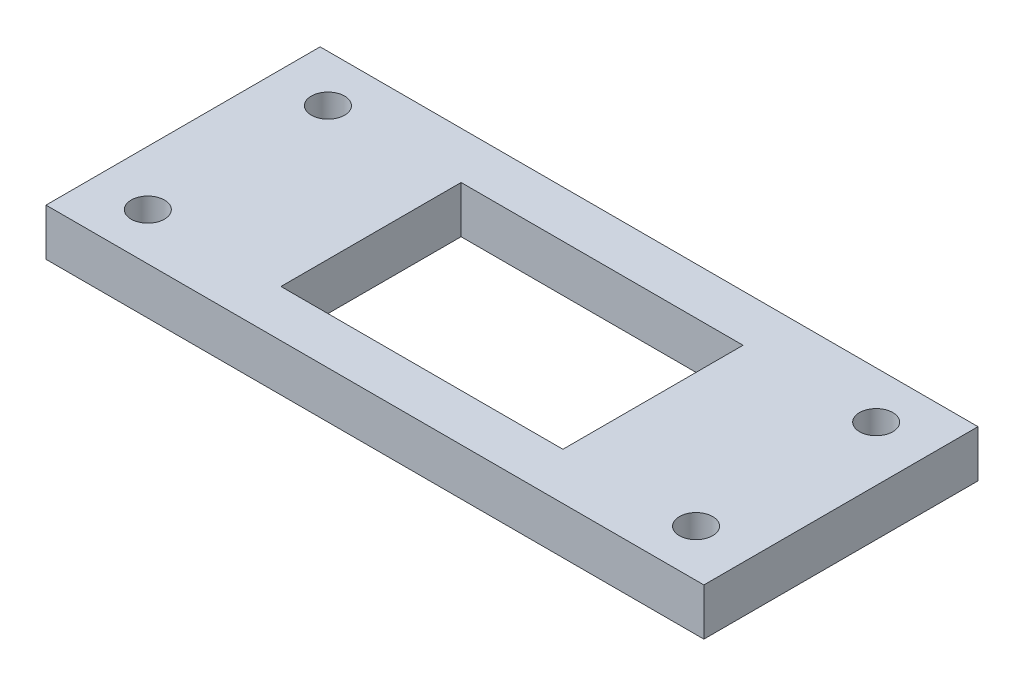
ISO-10303-21;
HEADER;
FILE_DESCRIPTION(('STEP AP214'),'2;1');
FILE_NAME('part.step','',(''),(''),'','','');
FILE_SCHEMA(('AUTOMOTIVE_DESIGN { 1 0 10303 214 1 1 1 1 }'));
ENDSEC;
DATA;
#1=APPLICATION_CONTEXT('core data for automotive mechanical design processes');
#2=APPLICATION_PROTOCOL_DEFINITION('international standard','automotive_design',2000,#1);
#3=PRODUCT_CONTEXT('',#1,'mechanical');
#4=PRODUCT('Part','Part','',(#3));
#5=PRODUCT_RELATED_PRODUCT_CATEGORY('part','',(#4));
#6=PRODUCT_DEFINITION_FORMATION('','',#4);
#7=PRODUCT_DEFINITION_CONTEXT('part definition',#1,'design');
#8=PRODUCT_DEFINITION('design','',#6,#7);
#9=PRODUCT_DEFINITION_SHAPE('','',#8);
#10=(LENGTH_UNIT() NAMED_UNIT(*) SI_UNIT(.MILLI.,.METRE.));
#11=(NAMED_UNIT(*) PLANE_ANGLE_UNIT() SI_UNIT($,.RADIAN.));
#12=(NAMED_UNIT(*) SI_UNIT($,.STERADIAN.) SOLID_ANGLE_UNIT());
#13=UNCERTAINTY_MEASURE_WITH_UNIT(LENGTH_MEASURE(1.E-05),#10,'distance_accuracy_value','');
#14=(GEOMETRIC_REPRESENTATION_CONTEXT(3) GLOBAL_UNCERTAINTY_ASSIGNED_CONTEXT((#13)) GLOBAL_UNIT_ASSIGNED_CONTEXT((#10,
#11,#12)) REPRESENTATION_CONTEXT('',''));
#15=CARTESIAN_POINT('',(0.,0.,0.));
#16=DIRECTION('',(0.,0.,1.));
#17=DIRECTION('',(1.,0.,0.));
#18=AXIS2_PLACEMENT_3D('',#15,#16,#17);
#19=CARTESIAN_POINT('',(0.,12.,0.));
#20=DIRECTION('',(0.,-1.,0.));
#21=DIRECTION('',(0.,0.,-1.));
#22=AXIS2_PLACEMENT_3D('',#19,#20,#21);
#23=PLANE('',#22);
#24=DIRECTION('',(0.,0.,1.));
#25=VECTOR('',#24,1.);
#26=CARTESIAN_POINT('',(-84.,12.,35.));
#27=LINE('',#26,#25);
#28=CARTESIAN_POINT('',(-84.,12.,-35.));
#29=VERTEX_POINT('',#28);
#30=CARTESIAN_POINT('',(-84.,12.,35.));
#31=VERTEX_POINT('',#30);
#32=EDGE_CURVE('E142',#29,#31,#27,.T.);
#33=ORIENTED_EDGE('',*,*,#32,.T.);
#34=DIRECTION('',(1.,0.,0.));
#35=VECTOR('',#34,1.);
#36=CARTESIAN_POINT('',(-84.,12.,35.));
#37=LINE('',#36,#35);
#38=CARTESIAN_POINT('',(84.,12.,35.));
#39=VERTEX_POINT('',#38);
#40=EDGE_CURVE('E147',#31,#39,#37,.T.);
#41=ORIENTED_EDGE('',*,*,#40,.T.);
#42=DIRECTION('',(0.,0.,-1.));
#43=VECTOR('',#42,1.);
#44=CARTESIAN_POINT('',(84.,12.,35.));
#45=LINE('',#44,#43);
#46=CARTESIAN_POINT('',(84.,12.,-35.));
#47=VERTEX_POINT('',#46);
#48=EDGE_CURVE('E146',#39,#47,#45,.T.);
#49=ORIENTED_EDGE('',*,*,#48,.T.);
#50=DIRECTION('',(-1.,0.,0.));
#51=VECTOR('',#50,1.);
#52=CARTESIAN_POINT('',(-84.,12.,-35.));
#53=LINE('',#52,#51);
#54=EDGE_CURVE('E151',#47,#29,#53,.T.);
#55=ORIENTED_EDGE('',*,*,#54,.T.);
#56=EDGE_LOOP('',(#33,#41,#49,#55));
#57=FACE_BOUND('',#56,.T.);
#58=DIRECTION('',(0.,0.,1.));
#59=VECTOR('',#58,1.);
#60=CARTESIAN_POINT('',(-36.,12.,23.));
#61=LINE('',#60,#59);
#62=CARTESIAN_POINT('',(-36.,12.,-23.));
#63=VERTEX_POINT('',#62);
#64=CARTESIAN_POINT('',(-36.,12.,23.));
#65=VERTEX_POINT('',#64);
#66=EDGE_CURVE('E101',#63,#65,#61,.T.);
#67=ORIENTED_EDGE('',*,*,#66,.F.);
#68=DIRECTION('',(-1.,0.,0.));
#69=VECTOR('',#68,1.);
#70=CARTESIAN_POINT('',(-36.,12.,-23.));
#71=LINE('',#70,#69);
#72=CARTESIAN_POINT('',(36.,12.,-23.));
#73=VERTEX_POINT('',#72);
#74=EDGE_CURVE('E130',#73,#63,#71,.T.);
#75=ORIENTED_EDGE('',*,*,#74,.F.);
#76=DIRECTION('',(0.,0.,-1.));
#77=VECTOR('',#76,1.);
#78=CARTESIAN_POINT('',(36.,12.,23.));
#79=LINE('',#78,#77);
#80=CARTESIAN_POINT('',(36.,12.,23.));
#81=VERTEX_POINT('',#80);
#82=EDGE_CURVE('E124',#81,#73,#79,.T.);
#83=ORIENTED_EDGE('',*,*,#82,.F.);
#84=DIRECTION('',(1.,0.,0.));
#85=VECTOR('',#84,1.);
#86=CARTESIAN_POINT('',(-36.,12.,23.));
#87=LINE('',#86,#85);
#88=EDGE_CURVE('E115',#65,#81,#87,.T.);
#89=ORIENTED_EDGE('',*,*,#88,.F.);
#90=EDGE_LOOP('',(#67,#75,#83,#89));
#91=FACE_BOUND('',#90,.T.);
#92=CARTESIAN_POINT('',(-70.,12.,23.));
#93=DIRECTION('',(0.,1.,0.));
#94=DIRECTION('',(0.,0.,1.));
#95=AXIS2_PLACEMENT_3D('',#92,#93,#94);
#96=CIRCLE('',#95,4.25);
#97=CARTESIAN_POINT('',(-70.,12.,27.25));
#98=VERTEX_POINT('',#97);
#99=EDGE_CURVE('E133',#98,#98,#96,.T.);
#100=ORIENTED_EDGE('',*,*,#99,.F.);
#101=EDGE_LOOP('',(#100));
#102=FACE_BOUND('',#101,.T.);
#103=CARTESIAN_POINT('',(70.,12.,23.));
#104=DIRECTION('',(0.,1.,0.));
#105=DIRECTION('',(0.,0.,1.));
#106=AXIS2_PLACEMENT_3D('',#103,#104,#105);
#107=CIRCLE('',#106,4.25);
#108=CARTESIAN_POINT('',(70.,12.,27.25));
#109=VERTEX_POINT('',#108);
#110=EDGE_CURVE('E255',#109,#109,#107,.T.);
#111=ORIENTED_EDGE('',*,*,#110,.F.);
#112=EDGE_LOOP('',(#111));
#113=FACE_BOUND('',#112,.T.);
#114=CARTESIAN_POINT('',(-70.,12.,-23.));
#115=DIRECTION('',(0.,1.,0.));
#116=DIRECTION('',(0.,0.,1.));
#117=AXIS2_PLACEMENT_3D('',#114,#115,#116);
#118=CIRCLE('',#117,4.25);
#119=CARTESIAN_POINT('',(-70.,12.,-18.75));
#120=VERTEX_POINT('',#119);
#121=EDGE_CURVE('E249',#120,#120,#118,.T.);
#122=ORIENTED_EDGE('',*,*,#121,.F.);
#123=EDGE_LOOP('',(#122));
#124=FACE_BOUND('',#123,.T.);
#125=CARTESIAN_POINT('',(70.,12.,-23.));
#126=DIRECTION('',(0.,1.,0.));
#127=DIRECTION('',(0.,0.,1.));
#128=AXIS2_PLACEMENT_3D('',#125,#126,#127);
#129=CIRCLE('',#128,4.25);
#130=CARTESIAN_POINT('',(70.,12.,-18.75));
#131=VERTEX_POINT('',#130);
#132=EDGE_CURVE('E238',#131,#131,#129,.T.);
#133=ORIENTED_EDGE('',*,*,#132,.F.);
#134=EDGE_LOOP('',(#133));
#135=FACE_BOUND('',#134,.T.);
#136=ADVANCED_FACE('F39',(#57,#91,#102,#113,#124,#135),#23,.F.);
#137=CARTESIAN_POINT('',(0.,0.,0.));
#138=DIRECTION('',(0.,-1.,0.));
#139=DIRECTION('',(0.,0.,-1.));
#140=AXIS2_PLACEMENT_3D('',#137,#138,#139);
#141=PLANE('',#140);
#142=CARTESIAN_POINT('',(-70.,0.,-23.));
#143=DIRECTION('',(0.,1.,0.));
#144=DIRECTION('',(0.,0.,1.));
#145=AXIS2_PLACEMENT_3D('',#142,#143,#144);
#146=CIRCLE('',#145,4.25);
#147=CARTESIAN_POINT('',(-70.,0.,-18.75));
#148=VERTEX_POINT('',#147);
#149=EDGE_CURVE('E247',#148,#148,#146,.T.);
#150=ORIENTED_EDGE('',*,*,#149,.T.);
#151=EDGE_LOOP('',(#150));
#152=FACE_BOUND('',#151,.T.);
#153=CARTESIAN_POINT('',(-70.,0.,23.));
#154=DIRECTION('',(0.,1.,0.));
#155=DIRECTION('',(0.,0.,1.));
#156=AXIS2_PLACEMENT_3D('',#153,#154,#155);
#157=CIRCLE('',#156,4.25);
#158=CARTESIAN_POINT('',(-70.,0.,27.25));
#159=VERTEX_POINT('',#158);
#160=EDGE_CURVE('E256',#159,#159,#157,.T.);
#161=ORIENTED_EDGE('',*,*,#160,.T.);
#162=EDGE_LOOP('',(#161));
#163=FACE_BOUND('',#162,.T.);
#164=DIRECTION('',(0.,0.,1.));
#165=VECTOR('',#164,1.);
#166=CARTESIAN_POINT('',(-84.,0.,35.));
#167=LINE('',#166,#165);
#168=CARTESIAN_POINT('',(-84.,0.,-35.));
#169=VERTEX_POINT('',#168);
#170=CARTESIAN_POINT('',(-84.,0.,35.));
#171=VERTEX_POINT('',#170);
#172=EDGE_CURVE('E120',#169,#171,#167,.T.);
#173=ORIENTED_EDGE('',*,*,#172,.F.);
#174=DIRECTION('',(-1.,0.,0.));
#175=VECTOR('',#174,1.);
#176=CARTESIAN_POINT('',(-84.,0.,-35.));
#177=LINE('',#176,#175);
#178=CARTESIAN_POINT('',(84.,0.,-35.));
#179=VERTEX_POINT('',#178);
#180=EDGE_CURVE('E150',#179,#169,#177,.T.);
#181=ORIENTED_EDGE('',*,*,#180,.F.);
#182=DIRECTION('',(0.,0.,-1.));
#183=VECTOR('',#182,1.);
#184=CARTESIAN_POINT('',(84.,0.,35.));
#185=LINE('',#184,#183);
#186=CARTESIAN_POINT('',(84.,0.,35.));
#187=VERTEX_POINT('',#186);
#188=EDGE_CURVE('E156',#187,#179,#185,.T.);
#189=ORIENTED_EDGE('',*,*,#188,.F.);
#190=DIRECTION('',(1.,0.,0.));
#191=VECTOR('',#190,1.);
#192=CARTESIAN_POINT('',(-84.,0.,35.));
#193=LINE('',#192,#191);
#194=EDGE_CURVE('E157',#171,#187,#193,.T.);
#195=ORIENTED_EDGE('',*,*,#194,.F.);
#196=EDGE_LOOP('',(#173,#181,#189,#195));
#197=FACE_BOUND('',#196,.T.);
#198=DIRECTION('',(-1.,0.,0.));
#199=VECTOR('',#198,1.);
#200=CARTESIAN_POINT('',(-36.,0.,-23.));
#201=LINE('',#200,#199);
#202=CARTESIAN_POINT('',(36.,0.,-23.));
#203=VERTEX_POINT('',#202);
#204=CARTESIAN_POINT('',(-36.,0.,-23.));
#205=VERTEX_POINT('',#204);
#206=EDGE_CURVE('E111',#203,#205,#201,.T.);
#207=ORIENTED_EDGE('',*,*,#206,.T.);
#208=DIRECTION('',(0.,0.,1.));
#209=VECTOR('',#208,1.);
#210=CARTESIAN_POINT('',(-36.,0.,23.));
#211=LINE('',#210,#209);
#212=CARTESIAN_POINT('',(-36.,0.,23.));
#213=VERTEX_POINT('',#212);
#214=EDGE_CURVE('E62',#205,#213,#211,.T.);
#215=ORIENTED_EDGE('',*,*,#214,.T.);
#216=DIRECTION('',(1.,0.,0.));
#217=VECTOR('',#216,1.);
#218=CARTESIAN_POINT('',(-36.,0.,23.));
#219=LINE('',#218,#217);
#220=CARTESIAN_POINT('',(36.,0.,23.));
#221=VERTEX_POINT('',#220);
#222=EDGE_CURVE('E118',#213,#221,#219,.T.);
#223=ORIENTED_EDGE('',*,*,#222,.T.);
#224=DIRECTION('',(0.,0.,-1.));
#225=VECTOR('',#224,1.);
#226=CARTESIAN_POINT('',(36.,0.,23.));
#227=LINE('',#226,#225);
#228=EDGE_CURVE('E134',#221,#203,#227,.T.);
#229=ORIENTED_EDGE('',*,*,#228,.T.);
#230=EDGE_LOOP('',(#207,#215,#223,#229));
#231=FACE_BOUND('',#230,.T.);
#232=CARTESIAN_POINT('',(70.,0.,23.));
#233=DIRECTION('',(0.,1.,0.));
#234=DIRECTION('',(0.,0.,1.));
#235=AXIS2_PLACEMENT_3D('',#232,#233,#234);
#236=CIRCLE('',#235,4.25);
#237=CARTESIAN_POINT('',(70.,0.,27.25));
#238=VERTEX_POINT('',#237);
#239=EDGE_CURVE('E252',#238,#238,#236,.T.);
#240=ORIENTED_EDGE('',*,*,#239,.T.);
#241=EDGE_LOOP('',(#240));
#242=FACE_BOUND('',#241,.T.);
#243=CARTESIAN_POINT('',(70.,0.,-23.));
#244=DIRECTION('',(0.,1.,0.));
#245=DIRECTION('',(0.,0.,1.));
#246=AXIS2_PLACEMENT_3D('',#243,#244,#245);
#247=CIRCLE('',#246,4.25);
#248=CARTESIAN_POINT('',(70.,0.,-18.75));
#249=VERTEX_POINT('',#248);
#250=EDGE_CURVE('E244',#249,#249,#247,.T.);
#251=ORIENTED_EDGE('',*,*,#250,.T.);
#252=EDGE_LOOP('',(#251));
#253=FACE_BOUND('',#252,.T.);
#254=ADVANCED_FACE('F176',(#152,#163,#197,#231,#242,#253),#141,.T.);
#255=CARTESIAN_POINT('',(-84.,12.,35.));
#256=DIRECTION('',(1.,0.,0.));
#257=DIRECTION('',(0.,0.,-1.));
#258=AXIS2_PLACEMENT_3D('',#255,#256,#257);
#259=PLANE('',#258);
#260=ORIENTED_EDGE('',*,*,#172,.T.);
#261=DIRECTION('',(0.,-1.,0.));
#262=VECTOR('',#261,1.);
#263=CARTESIAN_POINT('',(-84.,12.,35.));
#264=LINE('',#263,#262);
#265=EDGE_CURVE('E11',#31,#171,#264,.T.);
#266=ORIENTED_EDGE('',*,*,#265,.F.);
#267=ORIENTED_EDGE('',*,*,#32,.F.);
#268=DIRECTION('',(0.,-1.,0.));
#269=VECTOR('',#268,1.);
#270=CARTESIAN_POINT('',(-84.,12.,-35.));
#271=LINE('',#270,#269);
#272=EDGE_CURVE('E154',#29,#169,#271,.T.);
#273=ORIENTED_EDGE('',*,*,#272,.T.);
#274=EDGE_LOOP('',(#260,#266,#267,#273));
#275=FACE_BOUND('',#274,.T.);
#276=ADVANCED_FACE('F41',(#275),#259,.F.);
#277=CARTESIAN_POINT('',(-84.,12.,35.));
#278=DIRECTION('',(0.,0.,-1.));
#279=DIRECTION('',(-1.,0.,0.));
#280=AXIS2_PLACEMENT_3D('',#277,#278,#279);
#281=PLANE('',#280);
#282=ORIENTED_EDGE('',*,*,#194,.T.);
#283=DIRECTION('',(0.,-1.,0.));
#284=VECTOR('',#283,1.);
#285=CARTESIAN_POINT('',(84.,12.,35.));
#286=LINE('',#285,#284);
#287=EDGE_CURVE('E50',#39,#187,#286,.T.);
#288=ORIENTED_EDGE('',*,*,#287,.F.);
#289=ORIENTED_EDGE('',*,*,#40,.F.);
#290=ORIENTED_EDGE('',*,*,#265,.T.);
#291=EDGE_LOOP('',(#282,#288,#289,#290));
#292=FACE_BOUND('',#291,.T.);
#293=ADVANCED_FACE('F186',(#292),#281,.F.);
#294=CARTESIAN_POINT('',(84.,12.,35.));
#295=DIRECTION('',(-1.,0.,0.));
#296=DIRECTION('',(0.,0.,1.));
#297=AXIS2_PLACEMENT_3D('',#294,#295,#296);
#298=PLANE('',#297);
#299=ORIENTED_EDGE('',*,*,#188,.T.);
#300=DIRECTION('',(0.,-1.,0.));
#301=VECTOR('',#300,1.);
#302=CARTESIAN_POINT('',(84.,12.,-35.));
#303=LINE('',#302,#301);
#304=EDGE_CURVE('E164',#47,#179,#303,.T.);
#305=ORIENTED_EDGE('',*,*,#304,.F.);
#306=ORIENTED_EDGE('',*,*,#48,.F.);
#307=ORIENTED_EDGE('',*,*,#287,.T.);
#308=EDGE_LOOP('',(#299,#305,#306,#307));
#309=FACE_BOUND('',#308,.T.);
#310=ADVANCED_FACE('F169',(#309),#298,.F.);
#311=CARTESIAN_POINT('',(-84.,12.,-35.));
#312=DIRECTION('',(0.,0.,1.));
#313=DIRECTION('',(1.,0.,0.));
#314=AXIS2_PLACEMENT_3D('',#311,#312,#313);
#315=PLANE('',#314);
#316=ORIENTED_EDGE('',*,*,#180,.T.);
#317=ORIENTED_EDGE('',*,*,#272,.F.);
#318=ORIENTED_EDGE('',*,*,#54,.F.);
#319=ORIENTED_EDGE('',*,*,#304,.T.);
#320=EDGE_LOOP('',(#316,#317,#318,#319));
#321=FACE_BOUND('',#320,.T.);
#322=ADVANCED_FACE('F179',(#321),#315,.F.);
#323=CARTESIAN_POINT('',(-36.,12.,23.));
#324=DIRECTION('',(1.,0.,0.));
#325=DIRECTION('',(0.,0.,-1.));
#326=AXIS2_PLACEMENT_3D('',#323,#324,#325);
#327=PLANE('',#326);
#328=ORIENTED_EDGE('',*,*,#214,.F.);
#329=DIRECTION('',(0.,-1.,0.));
#330=VECTOR('',#329,1.);
#331=CARTESIAN_POINT('',(-36.,12.,-23.));
#332=LINE('',#331,#330);
#333=EDGE_CURVE('E109',#63,#205,#332,.T.);
#334=ORIENTED_EDGE('',*,*,#333,.F.);
#335=ORIENTED_EDGE('',*,*,#66,.T.);
#336=DIRECTION('',(0.,-1.,0.));
#337=VECTOR('',#336,1.);
#338=CARTESIAN_POINT('',(-36.,12.,23.));
#339=LINE('',#338,#337);
#340=EDGE_CURVE('E107',#65,#213,#339,.T.);
#341=ORIENTED_EDGE('',*,*,#340,.T.);
#342=EDGE_LOOP('',(#328,#334,#335,#341));
#343=FACE_BOUND('',#342,.T.);
#344=ADVANCED_FACE('F106',(#343),#327,.T.);
#345=CARTESIAN_POINT('',(-36.,12.,23.));
#346=DIRECTION('',(0.,0.,-1.));
#347=DIRECTION('',(-1.,0.,0.));
#348=AXIS2_PLACEMENT_3D('',#345,#346,#347);
#349=PLANE('',#348);
#350=ORIENTED_EDGE('',*,*,#222,.F.);
#351=ORIENTED_EDGE('',*,*,#340,.F.);
#352=ORIENTED_EDGE('',*,*,#88,.T.);
#353=DIRECTION('',(0.,-1.,0.));
#354=VECTOR('',#353,1.);
#355=CARTESIAN_POINT('',(36.,12.,23.));
#356=LINE('',#355,#354);
#357=EDGE_CURVE('E123',#81,#221,#356,.T.);
#358=ORIENTED_EDGE('',*,*,#357,.T.);
#359=EDGE_LOOP('',(#350,#351,#352,#358));
#360=FACE_BOUND('',#359,.T.);
#361=ADVANCED_FACE('F116',(#360),#349,.T.);
#362=CARTESIAN_POINT('',(36.,12.,23.));
#363=DIRECTION('',(-1.,0.,0.));
#364=DIRECTION('',(0.,0.,1.));
#365=AXIS2_PLACEMENT_3D('',#362,#363,#364);
#366=PLANE('',#365);
#367=ORIENTED_EDGE('',*,*,#228,.F.);
#368=ORIENTED_EDGE('',*,*,#357,.F.);
#369=ORIENTED_EDGE('',*,*,#82,.T.);
#370=DIRECTION('',(0.,-1.,0.));
#371=VECTOR('',#370,1.);
#372=CARTESIAN_POINT('',(36.,12.,-23.));
#373=LINE('',#372,#371);
#374=EDGE_CURVE('E53',#73,#203,#373,.T.);
#375=ORIENTED_EDGE('',*,*,#374,.T.);
#376=EDGE_LOOP('',(#367,#368,#369,#375));
#377=FACE_BOUND('',#376,.T.);
#378=ADVANCED_FACE('F210',(#377),#366,.T.);
#379=CARTESIAN_POINT('',(-36.,12.,-23.));
#380=DIRECTION('',(0.,0.,1.));
#381=DIRECTION('',(1.,0.,0.));
#382=AXIS2_PLACEMENT_3D('',#379,#380,#381);
#383=PLANE('',#382);
#384=ORIENTED_EDGE('',*,*,#206,.F.);
#385=ORIENTED_EDGE('',*,*,#374,.F.);
#386=ORIENTED_EDGE('',*,*,#74,.T.);
#387=ORIENTED_EDGE('',*,*,#333,.T.);
#388=EDGE_LOOP('',(#384,#385,#386,#387));
#389=FACE_BOUND('',#388,.T.);
#390=ADVANCED_FACE('F215',(#389),#383,.T.);
#391=CARTESIAN_POINT('',(-70.,12.,23.));
#392=DIRECTION('',(0.,-1.,0.));
#393=DIRECTION('',(0.,0.,-1.));
#394=AXIS2_PLACEMENT_3D('',#391,#392,#393);
#395=CYLINDRICAL_SURFACE('',#394,4.25);
#396=ORIENTED_EDGE('',*,*,#99,.T.);
#397=EDGE_LOOP('',(#396));
#398=FACE_BOUND('',#397,.T.);
#399=ORIENTED_EDGE('',*,*,#160,.F.);
#400=EDGE_LOOP('',(#399));
#401=FACE_BOUND('',#400,.T.);
#402=ADVANCED_FACE('F217',(#398,#401),#395,.F.);
#403=CARTESIAN_POINT('',(70.,12.,23.));
#404=DIRECTION('',(0.,-1.,0.));
#405=DIRECTION('',(0.,0.,-1.));
#406=AXIS2_PLACEMENT_3D('',#403,#404,#405);
#407=CYLINDRICAL_SURFACE('',#406,4.25);
#408=ORIENTED_EDGE('',*,*,#110,.T.);
#409=EDGE_LOOP('',(#408));
#410=FACE_BOUND('',#409,.T.);
#411=ORIENTED_EDGE('',*,*,#239,.F.);
#412=EDGE_LOOP('',(#411));
#413=FACE_BOUND('',#412,.T.);
#414=ADVANCED_FACE('F223',(#410,#413),#407,.F.);
#415=CARTESIAN_POINT('',(-70.,12.,-23.));
#416=DIRECTION('',(0.,-1.,0.));
#417=DIRECTION('',(0.,0.,-1.));
#418=AXIS2_PLACEMENT_3D('',#415,#416,#417);
#419=CYLINDRICAL_SURFACE('',#418,4.25);
#420=ORIENTED_EDGE('',*,*,#121,.T.);
#421=EDGE_LOOP('',(#420));
#422=FACE_BOUND('',#421,.T.);
#423=ORIENTED_EDGE('',*,*,#149,.F.);
#424=EDGE_LOOP('',(#423));
#425=FACE_BOUND('',#424,.T.);
#426=ADVANCED_FACE('F230',(#422,#425),#419,.F.);
#427=CARTESIAN_POINT('',(70.,12.,-23.));
#428=DIRECTION('',(0.,-1.,0.));
#429=DIRECTION('',(0.,0.,-1.));
#430=AXIS2_PLACEMENT_3D('',#427,#428,#429);
#431=CYLINDRICAL_SURFACE('',#430,4.25);
#432=ORIENTED_EDGE('',*,*,#132,.T.);
#433=EDGE_LOOP('',(#432));
#434=FACE_BOUND('',#433,.T.);
#435=ORIENTED_EDGE('',*,*,#250,.F.);
#436=EDGE_LOOP('',(#435));
#437=FACE_BOUND('',#436,.T.);
#438=ADVANCED_FACE('F231',(#434,#437),#431,.F.);
#439=CLOSED_SHELL('',(#136,#254,#276,#293,#310,#322,#344,#361,#378,#390,#402,#414,#426,#438));
#440=MANIFOLD_SOLID_BREP('B2',#439);
#441=ADVANCED_BREP_SHAPE_REPRESENTATION('',(#18,#440),#14);
#442=SHAPE_DEFINITION_REPRESENTATION(#9,#441);
ENDSEC;
END-ISO-10303-21;
